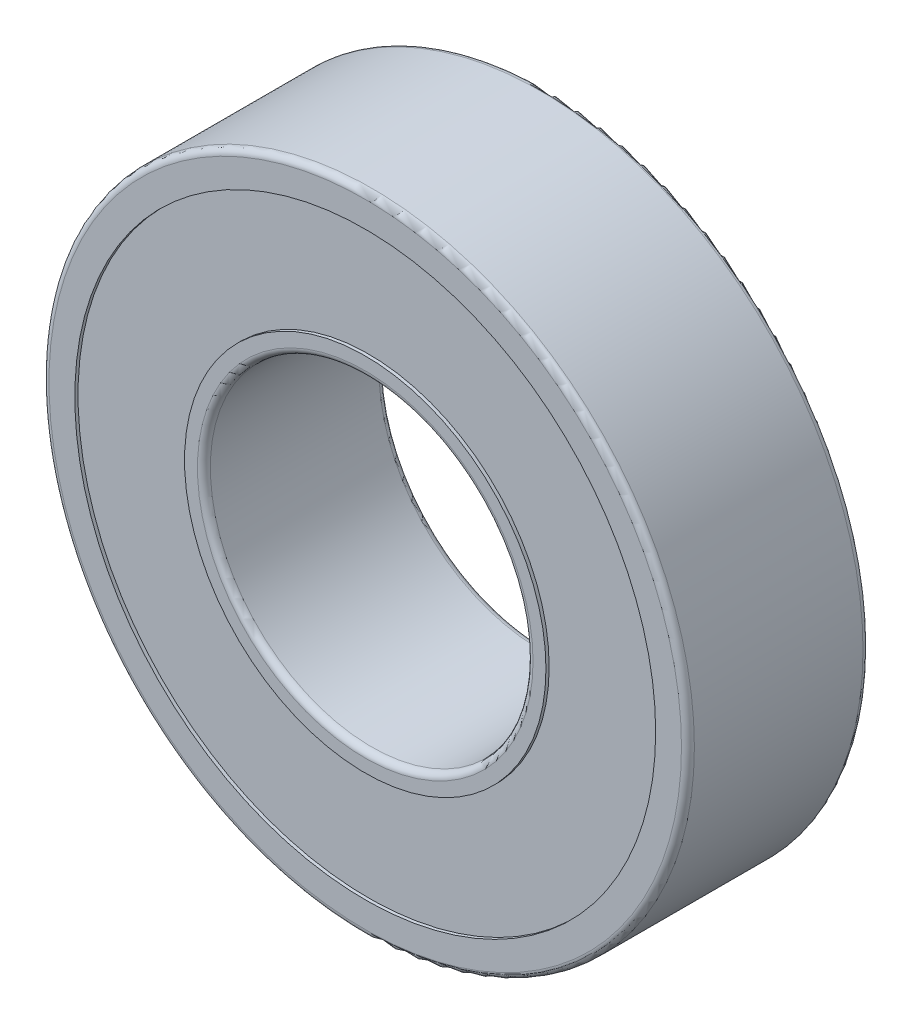
ISO-10303-21;
HEADER;
FILE_DESCRIPTION(('STEP AP214'),'2;1');
FILE_NAME('part.step','',(''),(''),'','','');
FILE_SCHEMA(('AUTOMOTIVE_DESIGN { 1 0 10303 214 1 1 1 1 }'));
ENDSEC;
DATA;
#1=APPLICATION_CONTEXT('core data for automotive mechanical design processes');
#2=APPLICATION_PROTOCOL_DEFINITION('international standard','automotive_design',2000,#1);
#3=PRODUCT_CONTEXT('',#1,'mechanical');
#4=PRODUCT('Part','Part','',(#3));
#5=PRODUCT_RELATED_PRODUCT_CATEGORY('part','',(#4));
#6=PRODUCT_DEFINITION_FORMATION('','',#4);
#7=PRODUCT_DEFINITION_CONTEXT('part definition',#1,'design');
#8=PRODUCT_DEFINITION('design','',#6,#7);
#9=PRODUCT_DEFINITION_SHAPE('','',#8);
#10=(LENGTH_UNIT() NAMED_UNIT(*) SI_UNIT(.MILLI.,.METRE.));
#11=(NAMED_UNIT(*) PLANE_ANGLE_UNIT() SI_UNIT($,.RADIAN.));
#12=(NAMED_UNIT(*) SI_UNIT($,.STERADIAN.) SOLID_ANGLE_UNIT());
#13=UNCERTAINTY_MEASURE_WITH_UNIT(LENGTH_MEASURE(1.E-05),#10,'distance_accuracy_value','');
#14=(GEOMETRIC_REPRESENTATION_CONTEXT(3) GLOBAL_UNCERTAINTY_ASSIGNED_CONTEXT((#13)) GLOBAL_UNIT_ASSIGNED_CONTEXT((#10,
#11,#12)) REPRESENTATION_CONTEXT('',''));
#15=CARTESIAN_POINT('',(0.,0.,0.));
#16=DIRECTION('',(0.,0.,1.));
#17=DIRECTION('',(1.,0.,0.));
#18=AXIS2_PLACEMENT_3D('',#15,#16,#17);
#19=CARTESIAN_POINT('',(147.733573080805,-1.25303970620557,14.0335));
#20=DIRECTION('',(0.,0.,-1.));
#21=DIRECTION('',(-1.,0.,0.));
#22=AXIS2_PLACEMENT_3D('',#19,#20,#21);
#23=CYLINDRICAL_SURFACE('',#22,14.224);
#24=CARTESIAN_POINT('',(147.733573080805,-1.25303970620557,14.0335));
#25=DIRECTION('',(0.,0.,1.));
#26=DIRECTION('',(1.,0.,0.));
#27=AXIS2_PLACEMENT_3D('',#24,#25,#26);
#28=CIRCLE('',#27,14.224);
#29=CARTESIAN_POINT('',(161.957573080805,-1.25303970620557,14.0335));
#30=VERTEX_POINT('',#29);
#31=EDGE_CURVE('E54',#30,#30,#28,.T.);
#32=ORIENTED_EDGE('',*,*,#31,.T.);
#33=EDGE_LOOP('',(#32));
#34=FACE_BOUND('',#33,.T.);
#35=CARTESIAN_POINT('',(147.733573080805,-1.25303970620557,0.254));
#36=DIRECTION('',(0.,0.,1.));
#37=DIRECTION('',(1.,0.,0.));
#38=AXIS2_PLACEMENT_3D('',#35,#36,#37);
#39=CIRCLE('',#38,14.224);
#40=CARTESIAN_POINT('',(161.957573080805,-1.25303970620557,0.254));
#41=VERTEX_POINT('',#40);
#42=EDGE_CURVE('E60',#41,#41,#39,.T.);
#43=ORIENTED_EDGE('',*,*,#42,.F.);
#44=EDGE_LOOP('',(#43));
#45=FACE_BOUND('',#44,.T.);
#46=ADVANCED_FACE('F47',(#34,#45),#23,.F.);
#47=CARTESIAN_POINT('',(147.733573080805,-1.25303970620557,14.0335));
#48=DIRECTION('',(0.,0.,-1.));
#49=DIRECTION('',(-1.,0.,0.));
#50=AXIS2_PLACEMENT_3D('',#47,#48,#49);
#51=CYLINDRICAL_SURFACE('',#50,22.86);
#52=CARTESIAN_POINT('',(147.733573080805,-1.25303970620557,14.0335));
#53=DIRECTION('',(0.,0.,1.));
#54=DIRECTION('',(1.,0.,0.));
#55=AXIS2_PLACEMENT_3D('',#52,#53,#54);
#56=CIRCLE('',#55,22.86);
#57=CARTESIAN_POINT('',(170.593573080805,-1.25303970620557,14.0335));
#58=VERTEX_POINT('',#57);
#59=EDGE_CURVE('E12',#58,#58,#56,.T.);
#60=ORIENTED_EDGE('',*,*,#59,.F.);
#61=EDGE_LOOP('',(#60));
#62=FACE_BOUND('',#61,.T.);
#63=CARTESIAN_POINT('',(147.733573080805,-1.25303970620557,0.254));
#64=DIRECTION('',(0.,0.,1.));
#65=DIRECTION('',(1.,0.,0.));
#66=AXIS2_PLACEMENT_3D('',#63,#64,#65);
#67=CIRCLE('',#66,22.86);
#68=CARTESIAN_POINT('',(170.593573080805,-1.25303970620557,0.254));
#69=VERTEX_POINT('',#68);
#70=EDGE_CURVE('E50',#69,#69,#67,.T.);
#71=ORIENTED_EDGE('',*,*,#70,.T.);
#72=EDGE_LOOP('',(#71));
#73=FACE_BOUND('',#72,.T.);
#74=ADVANCED_FACE('F67',(#62,#73),#51,.T.);
#75=CARTESIAN_POINT('',(0.,0.,14.0335));
#76=DIRECTION('',(0.,0.,1.));
#77=DIRECTION('',(1.,0.,0.));
#78=AXIS2_PLACEMENT_3D('',#75,#76,#77);
#79=PLANE('',#78);
#80=ORIENTED_EDGE('',*,*,#31,.F.);
#81=EDGE_LOOP('',(#80));
#82=FACE_BOUND('',#81,.T.);
#83=ORIENTED_EDGE('',*,*,#59,.T.);
#84=EDGE_LOOP('',(#83));
#85=FACE_BOUND('',#84,.T.);
#86=ADVANCED_FACE('F71',(#82,#85),#79,.T.);
#87=CARTESIAN_POINT('',(0.,0.,0.254));
#88=DIRECTION('',(0.,0.,1.));
#89=DIRECTION('',(1.,0.,0.));
#90=AXIS2_PLACEMENT_3D('',#87,#88,#89);
#91=PLANE('',#90);
#92=ORIENTED_EDGE('',*,*,#42,.T.);
#93=EDGE_LOOP('',(#92));
#94=FACE_BOUND('',#93,.T.);
#95=ORIENTED_EDGE('',*,*,#70,.F.);
#96=EDGE_LOOP('',(#95));
#97=FACE_BOUND('',#96,.T.);
#98=ADVANCED_FACE('F69',(#94,#97),#91,.F.);
#99=CLOSED_SHELL('',(#46,#74,#86,#98));
#100=MANIFOLD_SOLID_BREP('B2',#99);
#101=CARTESIAN_POINT('',(147.733573080805,-1.25303970620557,14.2875));
#102=DIRECTION('',(0.,0.,-1.));
#103=DIRECTION('',(-1.,0.,0.));
#104=AXIS2_PLACEMENT_3D('',#101,#102,#103);
#105=CYLINDRICAL_SURFACE('',#104,12.7);
#106=CARTESIAN_POINT('',(147.733573080805,-1.25303970620557,13.7795));
#107=DIRECTION('',(0.,0.,1.));
#108=DIRECTION('',(1.,0.,0.));
#109=AXIS2_PLACEMENT_3D('',#106,#107,#108);
#110=CIRCLE('',#109,12.7);
#111=CARTESIAN_POINT('',(160.433573080805,-1.25303970620557,13.7795));
#112=VERTEX_POINT('',#111);
#113=EDGE_CURVE('E130',#112,#112,#110,.T.);
#114=ORIENTED_EDGE('',*,*,#113,.T.);
#115=EDGE_LOOP('',(#114));
#116=FACE_BOUND('',#115,.T.);
#117=CARTESIAN_POINT('',(147.733573080805,-1.25303970620557,0.508));
#118=DIRECTION('',(0.,0.,1.));
#119=DIRECTION('',(1.,0.,0.));
#120=AXIS2_PLACEMENT_3D('',#117,#118,#119);
#121=CIRCLE('',#120,12.7);
#122=CARTESIAN_POINT('',(160.433573080805,-1.25303970620557,0.508));
#123=VERTEX_POINT('',#122);
#124=EDGE_CURVE('E134',#123,#123,#121,.F.);
#125=ORIENTED_EDGE('',*,*,#124,.T.);
#126=EDGE_LOOP('',(#125));
#127=FACE_BOUND('',#126,.T.);
#128=ADVANCED_FACE('F119',(#116,#127),#105,.F.);
#129=CARTESIAN_POINT('',(147.733573080805,-1.25303970620557,14.2875));
#130=DIRECTION('',(0.,0.,-1.));
#131=DIRECTION('',(-1.,0.,0.));
#132=AXIS2_PLACEMENT_3D('',#129,#130,#131);
#133=CYLINDRICAL_SURFACE('',#132,14.224);
#134=CARTESIAN_POINT('',(147.733573080805,-1.25303970620557,14.2875));
#135=DIRECTION('',(0.,0.,1.));
#136=DIRECTION('',(1.,0.,0.));
#137=AXIS2_PLACEMENT_3D('',#134,#135,#136);
#138=CIRCLE('',#137,14.224);
#139=CARTESIAN_POINT('',(161.957573080805,-1.25303970620557,14.2875));
#140=VERTEX_POINT('',#139);
#141=EDGE_CURVE('E139',#140,#140,#138,.T.);
#142=ORIENTED_EDGE('',*,*,#141,.F.);
#143=EDGE_LOOP('',(#142));
#144=FACE_BOUND('',#143,.T.);
#145=CARTESIAN_POINT('',(147.733573080805,-1.25303970620557,0.));
#146=DIRECTION('',(0.,0.,1.));
#147=DIRECTION('',(1.,0.,0.));
#148=AXIS2_PLACEMENT_3D('',#145,#146,#147);
#149=CIRCLE('',#148,14.224);
#150=CARTESIAN_POINT('',(161.957573080805,-1.25303970620557,0.));
#151=VERTEX_POINT('',#150);
#152=EDGE_CURVE('E140',#151,#151,#149,.T.);
#153=ORIENTED_EDGE('',*,*,#152,.T.);
#154=EDGE_LOOP('',(#153));
#155=FACE_BOUND('',#154,.T.);
#156=ADVANCED_FACE('F148',(#144,#155),#133,.T.);
#157=CARTESIAN_POINT('',(0.,0.,14.2875));
#158=DIRECTION('',(0.,0.,1.));
#159=DIRECTION('',(1.,0.,0.));
#160=AXIS2_PLACEMENT_3D('',#157,#158,#159);
#161=PLANE('',#160);
#162=CARTESIAN_POINT('',(147.733573080805,-1.25303970620557,14.2875));
#163=DIRECTION('',(0.,0.,1.));
#164=DIRECTION('',(1.,0.,0.));
#165=AXIS2_PLACEMENT_3D('',#162,#163,#164);
#166=CIRCLE('',#165,13.208);
#167=CARTESIAN_POINT('',(160.941573080805,-1.25303970620557,14.2875));
#168=VERTEX_POINT('',#167);
#169=EDGE_CURVE('E126',#168,#168,#166,.F.);
#170=ORIENTED_EDGE('',*,*,#169,.T.);
#171=EDGE_LOOP('',(#170));
#172=FACE_BOUND('',#171,.T.);
#173=ORIENTED_EDGE('',*,*,#141,.T.);
#174=EDGE_LOOP('',(#173));
#175=FACE_BOUND('',#174,.T.);
#176=ADVANCED_FACE('F146',(#172,#175),#161,.T.);
#177=CARTESIAN_POINT('',(0.,0.,0.));
#178=DIRECTION('',(0.,0.,1.));
#179=DIRECTION('',(1.,0.,0.));
#180=AXIS2_PLACEMENT_3D('',#177,#178,#179);
#181=PLANE('',#180);
#182=CARTESIAN_POINT('',(147.733573080805,-1.25303970620557,0.));
#183=DIRECTION('',(0.,0.,1.));
#184=DIRECTION('',(1.,0.,0.));
#185=AXIS2_PLACEMENT_3D('',#182,#183,#184);
#186=CIRCLE('',#185,13.208);
#187=CARTESIAN_POINT('',(160.941573080805,-1.25303970620557,0.));
#188=VERTEX_POINT('',#187);
#189=EDGE_CURVE('E46',#188,#188,#186,.T.);
#190=ORIENTED_EDGE('',*,*,#189,.T.);
#191=EDGE_LOOP('',(#190));
#192=FACE_BOUND('',#191,.T.);
#193=ORIENTED_EDGE('',*,*,#152,.F.);
#194=EDGE_LOOP('',(#193));
#195=FACE_BOUND('',#194,.T.);
#196=ADVANCED_FACE('F154',(#192,#195),#181,.F.);
#197=CARTESIAN_POINT('',(147.733573080805,-1.25303970620557,13.7795));
#198=DIRECTION('',(0.,0.,1.));
#199=DIRECTION('',(1.,0.,0.));
#200=AXIS2_PLACEMENT_3D('',#197,#198,#199);
#201=TOROIDAL_SURFACE('',#200,13.208,0.508);
#202=ORIENTED_EDGE('',*,*,#169,.F.);
#203=EDGE_LOOP('',(#202));
#204=FACE_BOUND('',#203,.T.);
#205=ORIENTED_EDGE('',*,*,#113,.F.);
#206=EDGE_LOOP('',(#205));
#207=FACE_BOUND('',#206,.T.);
#208=ADVANCED_FACE('F156',(#204,#207),#201,.T.);
#209=CARTESIAN_POINT('',(147.733573080805,-1.25303970620557,0.508));
#210=DIRECTION('',(0.,0.,1.));
#211=DIRECTION('',(1.,0.,0.));
#212=AXIS2_PLACEMENT_3D('',#209,#210,#211);
#213=TOROIDAL_SURFACE('',#212,13.208,0.508);
#214=ORIENTED_EDGE('',*,*,#124,.F.);
#215=EDGE_LOOP('',(#214));
#216=FACE_BOUND('',#215,.T.);
#217=ORIENTED_EDGE('',*,*,#189,.F.);
#218=EDGE_LOOP('',(#217));
#219=FACE_BOUND('',#218,.T.);
#220=ADVANCED_FACE('F121',(#216,#219),#213,.T.);
#221=CLOSED_SHELL('',(#128,#156,#176,#196,#208,#220));
#222=MANIFOLD_SOLID_BREP('B7',#221);
#223=CARTESIAN_POINT('',(147.733573080805,-1.25303970620557,14.2875));
#224=DIRECTION('',(0.,0.,-1.));
#225=DIRECTION('',(-1.,0.,0.));
#226=AXIS2_PLACEMENT_3D('',#223,#224,#225);
#227=CYLINDRICAL_SURFACE('',#226,22.86);
#228=CARTESIAN_POINT('',(147.733573080805,-1.25303970620557,14.2875));
#229=DIRECTION('',(0.,0.,1.));
#230=DIRECTION('',(1.,0.,0.));
#231=AXIS2_PLACEMENT_3D('',#228,#229,#230);
#232=CIRCLE('',#231,22.86);
#233=CARTESIAN_POINT('',(170.593573080805,-1.25303970620557,14.2875));
#234=VERTEX_POINT('',#233);
#235=EDGE_CURVE('E230',#234,#234,#232,.T.);
#236=ORIENTED_EDGE('',*,*,#235,.T.);
#237=EDGE_LOOP('',(#236));
#238=FACE_BOUND('',#237,.T.);
#239=CARTESIAN_POINT('',(147.733573080805,-1.25303970620557,0.));
#240=DIRECTION('',(0.,0.,1.));
#241=DIRECTION('',(1.,0.,0.));
#242=AXIS2_PLACEMENT_3D('',#239,#240,#241);
#243=CIRCLE('',#242,22.86);
#244=CARTESIAN_POINT('',(170.593573080805,-1.25303970620557,0.));
#245=VERTEX_POINT('',#244);
#246=EDGE_CURVE('E231',#245,#245,#243,.T.);
#247=ORIENTED_EDGE('',*,*,#246,.F.);
#248=EDGE_LOOP('',(#247));
#249=FACE_BOUND('',#248,.T.);
#250=ADVANCED_FACE('F210',(#238,#249),#227,.F.);
#251=CARTESIAN_POINT('',(147.733573080805,-1.25303970620557,14.2875));
#252=DIRECTION('',(0.,0.,-1.));
#253=DIRECTION('',(-1.,0.,0.));
#254=AXIS2_PLACEMENT_3D('',#251,#252,#253);
#255=CYLINDRICAL_SURFACE('',#254,25.4);
#256=CARTESIAN_POINT('',(147.733573080805,-1.25303970620557,13.7795));
#257=DIRECTION('',(0.,0.,1.));
#258=DIRECTION('',(1.,0.,0.));
#259=AXIS2_PLACEMENT_3D('',#256,#257,#258);
#260=CIRCLE('',#259,25.4);
#261=CARTESIAN_POINT('',(173.133573080805,-1.25303970620557,13.7795));
#262=VERTEX_POINT('',#261);
#263=EDGE_CURVE('E217',#262,#262,#260,.F.);
#264=ORIENTED_EDGE('',*,*,#263,.T.);
#265=EDGE_LOOP('',(#264));
#266=FACE_BOUND('',#265,.T.);
#267=CARTESIAN_POINT('',(147.733573080805,-1.25303970620557,0.508));
#268=DIRECTION('',(0.,0.,1.));
#269=DIRECTION('',(1.,0.,0.));
#270=AXIS2_PLACEMENT_3D('',#267,#268,#269);
#271=CIRCLE('',#270,25.4);
#272=CARTESIAN_POINT('',(173.133573080805,-1.25303970620557,0.508));
#273=VERTEX_POINT('',#272);
#274=EDGE_CURVE('E221',#273,#273,#271,.T.);
#275=ORIENTED_EDGE('',*,*,#274,.T.);
#276=EDGE_LOOP('',(#275));
#277=FACE_BOUND('',#276,.T.);
#278=ADVANCED_FACE('F242',(#266,#277),#255,.T.);
#279=CARTESIAN_POINT('',(0.,0.,14.2875));
#280=DIRECTION('',(0.,0.,1.));
#281=DIRECTION('',(1.,0.,0.));
#282=AXIS2_PLACEMENT_3D('',#279,#280,#281);
#283=PLANE('',#282);
#284=CARTESIAN_POINT('',(147.733573080805,-1.25303970620557,14.2875));
#285=DIRECTION('',(0.,0.,1.));
#286=DIRECTION('',(1.,0.,0.));
#287=AXIS2_PLACEMENT_3D('',#284,#285,#286);
#288=CIRCLE('',#287,24.892);
#289=CARTESIAN_POINT('',(172.625573080805,-1.25303970620557,14.2875));
#290=VERTEX_POINT('',#289);
#291=EDGE_CURVE('E225',#290,#290,#288,.T.);
#292=ORIENTED_EDGE('',*,*,#291,.T.);
#293=EDGE_LOOP('',(#292));
#294=FACE_BOUND('',#293,.T.);
#295=ORIENTED_EDGE('',*,*,#235,.F.);
#296=EDGE_LOOP('',(#295));
#297=FACE_BOUND('',#296,.T.);
#298=ADVANCED_FACE('F239',(#294,#297),#283,.T.);
#299=CARTESIAN_POINT('',(0.,0.,0.));
#300=DIRECTION('',(0.,0.,1.));
#301=DIRECTION('',(1.,0.,0.));
#302=AXIS2_PLACEMENT_3D('',#299,#300,#301);
#303=PLANE('',#302);
#304=CARTESIAN_POINT('',(147.733573080805,-1.25303970620557,0.));
#305=DIRECTION('',(0.,0.,1.));
#306=DIRECTION('',(1.,0.,0.));
#307=AXIS2_PLACEMENT_3D('',#304,#305,#306);
#308=CIRCLE('',#307,24.892);
#309=CARTESIAN_POINT('',(172.625573080805,-1.25303970620557,0.));
#310=VERTEX_POINT('',#309);
#311=EDGE_CURVE('E118',#310,#310,#308,.F.);
#312=ORIENTED_EDGE('',*,*,#311,.T.);
#313=EDGE_LOOP('',(#312));
#314=FACE_BOUND('',#313,.T.);
#315=ORIENTED_EDGE('',*,*,#246,.T.);
#316=EDGE_LOOP('',(#315));
#317=FACE_BOUND('',#316,.T.);
#318=ADVANCED_FACE('F241',(#314,#317),#303,.F.);
#319=CARTESIAN_POINT('',(147.733573080805,-1.25303970620557,13.7795));
#320=DIRECTION('',(0.,0.,1.));
#321=DIRECTION('',(1.,0.,0.));
#322=AXIS2_PLACEMENT_3D('',#319,#320,#321);
#323=TOROIDAL_SURFACE('',#322,24.892,0.508);
#324=ORIENTED_EDGE('',*,*,#263,.F.);
#325=EDGE_LOOP('',(#324));
#326=FACE_BOUND('',#325,.T.);
#327=ORIENTED_EDGE('',*,*,#291,.F.);
#328=EDGE_LOOP('',(#327));
#329=FACE_BOUND('',#328,.T.);
#330=ADVANCED_FACE('F249',(#326,#329),#323,.T.);
#331=CARTESIAN_POINT('',(147.733573080805,-1.25303970620557,0.508));
#332=DIRECTION('',(0.,0.,1.));
#333=DIRECTION('',(1.,0.,0.));
#334=AXIS2_PLACEMENT_3D('',#331,#332,#333);
#335=TOROIDAL_SURFACE('',#334,24.892,0.508);
#336=ORIENTED_EDGE('',*,*,#311,.F.);
#337=EDGE_LOOP('',(#336));
#338=FACE_BOUND('',#337,.T.);
#339=ORIENTED_EDGE('',*,*,#274,.F.);
#340=EDGE_LOOP('',(#339));
#341=FACE_BOUND('',#340,.T.);
#342=ADVANCED_FACE('F212',(#338,#341),#335,.T.);
#343=CLOSED_SHELL('',(#250,#278,#298,#318,#330,#342));
#344=MANIFOLD_SOLID_BREP('B41',#343);
#345=ADVANCED_BREP_SHAPE_REPRESENTATION('',(#18,#100,#222,#344),#14);
#346=SHAPE_DEFINITION_REPRESENTATION(#9,#345);
ENDSEC;
END-ISO-10303-21;
